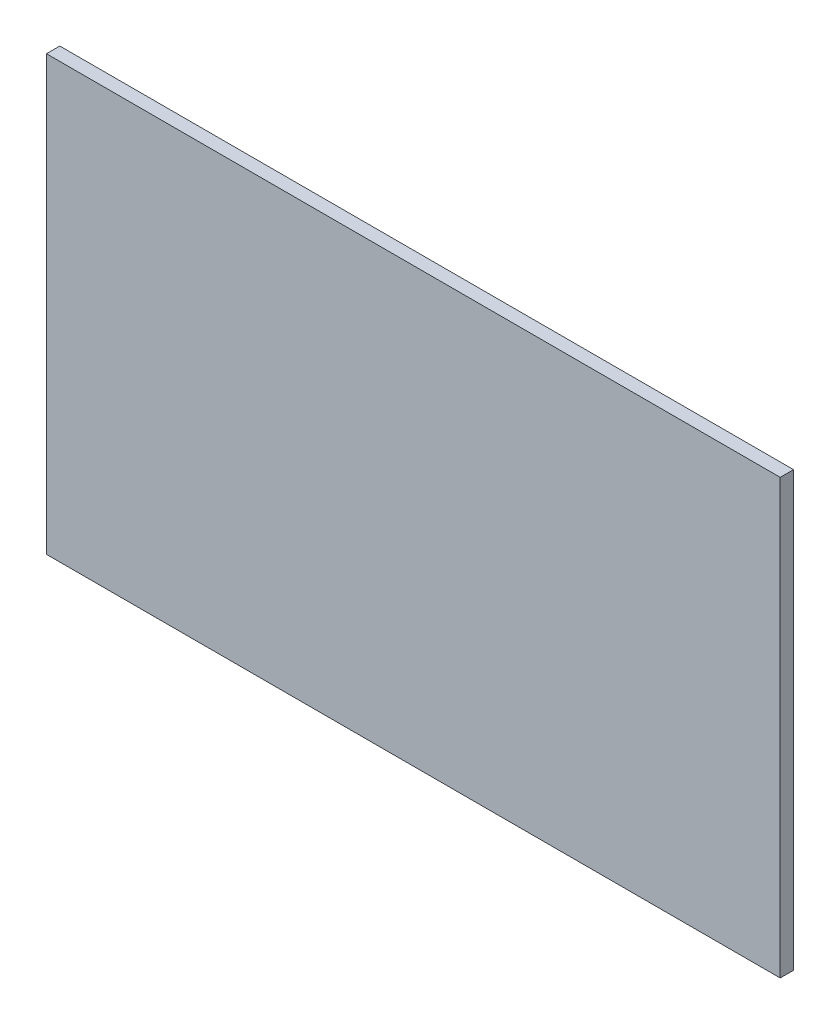
ISO-10303-21;
HEADER;
FILE_DESCRIPTION(('STEP AP214'),'2;1');
FILE_NAME('part.step','',(''),(''),'','','');
FILE_SCHEMA(('AUTOMOTIVE_DESIGN { 1 0 10303 214 1 1 1 1 }'));
ENDSEC;
DATA;
#1=APPLICATION_CONTEXT('core data for automotive mechanical design processes');
#2=APPLICATION_PROTOCOL_DEFINITION('international standard','automotive_design',2000,#1);
#3=PRODUCT_CONTEXT('',#1,'mechanical');
#4=PRODUCT('Part','Part','',(#3));
#5=PRODUCT_RELATED_PRODUCT_CATEGORY('part','',(#4));
#6=PRODUCT_DEFINITION_FORMATION('','',#4);
#7=PRODUCT_DEFINITION_CONTEXT('part definition',#1,'design');
#8=PRODUCT_DEFINITION('design','',#6,#7);
#9=PRODUCT_DEFINITION_SHAPE('','',#8);
#10=(LENGTH_UNIT() NAMED_UNIT(*) SI_UNIT(.MILLI.,.METRE.));
#11=(NAMED_UNIT(*) PLANE_ANGLE_UNIT() SI_UNIT($,.RADIAN.));
#12=(NAMED_UNIT(*) SI_UNIT($,.STERADIAN.) SOLID_ANGLE_UNIT());
#13=UNCERTAINTY_MEASURE_WITH_UNIT(LENGTH_MEASURE(1.E-05),#10,'distance_accuracy_value','');
#14=(GEOMETRIC_REPRESENTATION_CONTEXT(3) GLOBAL_UNCERTAINTY_ASSIGNED_CONTEXT((#13)) GLOBAL_UNIT_ASSIGNED_CONTEXT((#10,
#11,#12)) REPRESENTATION_CONTEXT('',''));
#15=CARTESIAN_POINT('',(0.,0.,0.));
#16=DIRECTION('',(0.,0.,1.));
#17=DIRECTION('',(1.,0.,0.));
#18=AXIS2_PLACEMENT_3D('',#15,#16,#17);
#19=CARTESIAN_POINT('',(-753.022452504318,717.962003454232,40.));
#20=DIRECTION('',(1.,0.,0.));
#21=DIRECTION('',(0.,1.,0.));
#22=AXIS2_PLACEMENT_3D('',#19,#20,#21);
#23=PLANE('',#22);
#24=DIRECTION('',(0.,-1.,0.));
#25=VECTOR('',#24,1.);
#26=CARTESIAN_POINT('',(-753.022452504318,717.962003454232,0.));
#27=LINE('',#26,#25);
#28=CARTESIAN_POINT('',(-753.022452504318,717.962003454232,0.));
#29=VERTEX_POINT('',#28);
#30=CARTESIAN_POINT('',(-753.022452504318,-582.037996545768,0.));
#31=VERTEX_POINT('',#30);
#32=EDGE_CURVE('E96',#29,#31,#27,.T.);
#33=ORIENTED_EDGE('',*,*,#32,.T.);
#34=DIRECTION('',(0.,0.,-1.));
#35=VECTOR('',#34,1.);
#36=CARTESIAN_POINT('',(-753.022452504318,-582.037996545768,40.));
#37=LINE('',#36,#35);
#38=CARTESIAN_POINT('',(-753.022452504318,-582.037996545768,40.));
#39=VERTEX_POINT('',#38);
#40=EDGE_CURVE('E11',#39,#31,#37,.T.);
#41=ORIENTED_EDGE('',*,*,#40,.F.);
#42=DIRECTION('',(0.,-1.,0.));
#43=VECTOR('',#42,1.);
#44=CARTESIAN_POINT('',(-753.022452504318,717.962003454232,40.));
#45=LINE('',#44,#43);
#46=CARTESIAN_POINT('',(-753.022452504318,717.962003454232,40.));
#47=VERTEX_POINT('',#46);
#48=EDGE_CURVE('E84',#47,#39,#45,.T.);
#49=ORIENTED_EDGE('',*,*,#48,.F.);
#50=DIRECTION('',(0.,0.,-1.));
#51=VECTOR('',#50,1.);
#52=CARTESIAN_POINT('',(-753.022452504318,717.962003454232,40.));
#53=LINE('',#52,#51);
#54=EDGE_CURVE('E92',#47,#29,#53,.T.);
#55=ORIENTED_EDGE('',*,*,#54,.T.);
#56=EDGE_LOOP('',(#33,#41,#49,#55));
#57=FACE_BOUND('',#56,.T.);
#58=ADVANCED_FACE('F33',(#57),#23,.F.);
#59=CARTESIAN_POINT('',(-753.022452504318,-582.037996545768,40.));
#60=DIRECTION('',(0.,1.,0.));
#61=DIRECTION('',(0.,0.,1.));
#62=AXIS2_PLACEMENT_3D('',#59,#60,#61);
#63=PLANE('',#62);
#64=DIRECTION('',(1.,0.,0.));
#65=VECTOR('',#64,1.);
#66=CARTESIAN_POINT('',(-753.022452504318,-582.037996545768,0.));
#67=LINE('',#66,#65);
#68=CARTESIAN_POINT('',(1446.97754749568,-582.037996545768,0.));
#69=VERTEX_POINT('',#68);
#70=EDGE_CURVE('E88',#31,#69,#67,.T.);
#71=ORIENTED_EDGE('',*,*,#70,.T.);
#72=DIRECTION('',(0.,0.,-1.));
#73=VECTOR('',#72,1.);
#74=CARTESIAN_POINT('',(1446.97754749568,-582.037996545768,40.));
#75=LINE('',#74,#73);
#76=CARTESIAN_POINT('',(1446.97754749568,-582.037996545768,40.));
#77=VERTEX_POINT('',#76);
#78=EDGE_CURVE('E41',#77,#69,#75,.T.);
#79=ORIENTED_EDGE('',*,*,#78,.F.);
#80=DIRECTION('',(1.,0.,0.));
#81=VECTOR('',#80,1.);
#82=CARTESIAN_POINT('',(-753.022452504318,-582.037996545768,40.));
#83=LINE('',#82,#81);
#84=EDGE_CURVE('E79',#39,#77,#83,.T.);
#85=ORIENTED_EDGE('',*,*,#84,.F.);
#86=ORIENTED_EDGE('',*,*,#40,.T.);
#87=EDGE_LOOP('',(#71,#79,#85,#86));
#88=FACE_BOUND('',#87,.T.);
#89=ADVANCED_FACE('F87',(#88),#63,.F.);
#90=CARTESIAN_POINT('',(1446.97754749568,717.962003454232,40.));
#91=DIRECTION('',(-1.,0.,0.));
#92=DIRECTION('',(0.,-1.,0.));
#93=AXIS2_PLACEMENT_3D('',#90,#91,#92);
#94=PLANE('',#93);
#95=DIRECTION('',(0.,1.,0.));
#96=VECTOR('',#95,1.);
#97=CARTESIAN_POINT('',(1446.97754749568,717.962003454232,0.));
#98=LINE('',#97,#96);
#99=CARTESIAN_POINT('',(1446.97754749568,717.962003454232,0.));
#100=VERTEX_POINT('',#99);
#101=EDGE_CURVE('E66',#69,#100,#98,.T.);
#102=ORIENTED_EDGE('',*,*,#101,.T.);
#103=DIRECTION('',(0.,0.,-1.));
#104=VECTOR('',#103,1.);
#105=CARTESIAN_POINT('',(1446.97754749568,717.962003454232,40.));
#106=LINE('',#105,#104);
#107=CARTESIAN_POINT('',(1446.97754749568,717.962003454232,40.));
#108=VERTEX_POINT('',#107);
#109=EDGE_CURVE('E89',#108,#100,#106,.T.);
#110=ORIENTED_EDGE('',*,*,#109,.F.);
#111=DIRECTION('',(0.,1.,0.));
#112=VECTOR('',#111,1.);
#113=CARTESIAN_POINT('',(1446.97754749568,717.962003454232,40.));
#114=LINE('',#113,#112);
#115=EDGE_CURVE('E82',#77,#108,#114,.T.);
#116=ORIENTED_EDGE('',*,*,#115,.F.);
#117=ORIENTED_EDGE('',*,*,#78,.T.);
#118=EDGE_LOOP('',(#102,#110,#116,#117));
#119=FACE_BOUND('',#118,.T.);
#120=ADVANCED_FACE('F90',(#119),#94,.F.);
#121=CARTESIAN_POINT('',(-753.022452504318,717.962003454232,40.));
#122=DIRECTION('',(0.,-1.,0.));
#123=DIRECTION('',(0.,0.,-1.));
#124=AXIS2_PLACEMENT_3D('',#121,#122,#123);
#125=PLANE('',#124);
#126=DIRECTION('',(-1.,0.,0.));
#127=VECTOR('',#126,1.);
#128=CARTESIAN_POINT('',(-753.022452504318,717.962003454232,0.));
#129=LINE('',#128,#127);
#130=EDGE_CURVE('E72',#100,#29,#129,.T.);
#131=ORIENTED_EDGE('',*,*,#130,.T.);
#132=ORIENTED_EDGE('',*,*,#54,.F.);
#133=DIRECTION('',(-1.,0.,0.));
#134=VECTOR('',#133,1.);
#135=CARTESIAN_POINT('',(-753.022452504318,717.962003454232,40.));
#136=LINE('',#135,#134);
#137=EDGE_CURVE('E49',#108,#47,#136,.T.);
#138=ORIENTED_EDGE('',*,*,#137,.F.);
#139=ORIENTED_EDGE('',*,*,#109,.T.);
#140=EDGE_LOOP('',(#131,#132,#138,#139));
#141=FACE_BOUND('',#140,.T.);
#142=ADVANCED_FACE('F103',(#141),#125,.F.);
#143=CARTESIAN_POINT('',(0.,0.,40.));
#144=DIRECTION('',(0.,0.,1.));
#145=DIRECTION('',(1.,0.,0.));
#146=AXIS2_PLACEMENT_3D('',#143,#144,#145);
#147=PLANE('',#146);
#148=ORIENTED_EDGE('',*,*,#48,.T.);
#149=ORIENTED_EDGE('',*,*,#84,.T.);
#150=ORIENTED_EDGE('',*,*,#115,.T.);
#151=ORIENTED_EDGE('',*,*,#137,.T.);
#152=EDGE_LOOP('',(#148,#149,#150,#151));
#153=FACE_BOUND('',#152,.T.);
#154=ADVANCED_FACE('F80',(#153),#147,.T.);
#155=CARTESIAN_POINT('',(0.,0.,0.));
#156=DIRECTION('',(0.,0.,1.));
#157=DIRECTION('',(1.,0.,0.));
#158=AXIS2_PLACEMENT_3D('',#155,#156,#157);
#159=PLANE('',#158);
#160=ORIENTED_EDGE('',*,*,#32,.F.);
#161=ORIENTED_EDGE('',*,*,#130,.F.);
#162=ORIENTED_EDGE('',*,*,#101,.F.);
#163=ORIENTED_EDGE('',*,*,#70,.F.);
#164=EDGE_LOOP('',(#160,#161,#162,#163));
#165=FACE_BOUND('',#164,.T.);
#166=ADVANCED_FACE('F106',(#165),#159,.F.);
#167=CLOSED_SHELL('',(#58,#89,#120,#142,#154,#166));
#168=MANIFOLD_SOLID_BREP('B2',#167);
#169=ADVANCED_BREP_SHAPE_REPRESENTATION('',(#18,#168),#14);
#170=SHAPE_DEFINITION_REPRESENTATION(#9,#169);
ENDSEC;
END-ISO-10303-21;
